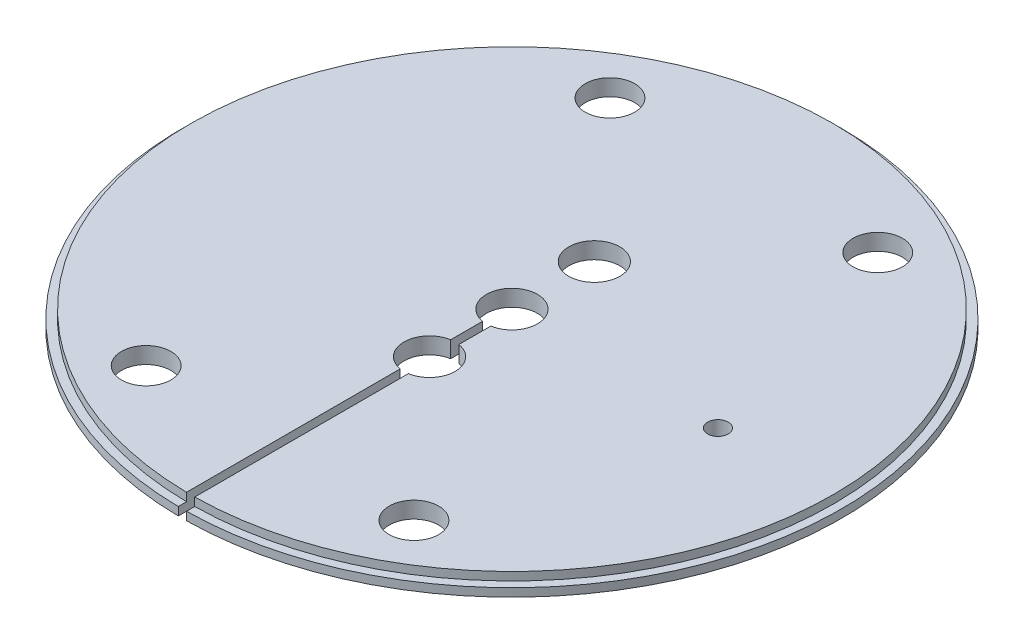
ISO-10303-21;
HEADER;
FILE_DESCRIPTION(('STEP AP214'),'2;1');
FILE_NAME('part.step','',(''),(''),'','','');
FILE_SCHEMA(('AUTOMOTIVE_DESIGN { 1 0 10303 214 1 1 1 1 }'));
ENDSEC;
DATA;
#1=APPLICATION_CONTEXT('core data for automotive mechanical design processes');
#2=APPLICATION_PROTOCOL_DEFINITION('international standard','automotive_design',2000,#1);
#3=PRODUCT_CONTEXT('',#1,'mechanical');
#4=PRODUCT('Part','Part','',(#3));
#5=PRODUCT_RELATED_PRODUCT_CATEGORY('part','',(#4));
#6=PRODUCT_DEFINITION_FORMATION('','',#4);
#7=PRODUCT_DEFINITION_CONTEXT('part definition',#1,'design');
#8=PRODUCT_DEFINITION('design','',#6,#7);
#9=PRODUCT_DEFINITION_SHAPE('','',#8);
#10=(LENGTH_UNIT() NAMED_UNIT(*) SI_UNIT(.MILLI.,.METRE.));
#11=(NAMED_UNIT(*) PLANE_ANGLE_UNIT() SI_UNIT($,.RADIAN.));
#12=(NAMED_UNIT(*) SI_UNIT($,.STERADIAN.) SOLID_ANGLE_UNIT());
#13=UNCERTAINTY_MEASURE_WITH_UNIT(LENGTH_MEASURE(1.E-05),#10,'distance_accuracy_value','');
#14=(GEOMETRIC_REPRESENTATION_CONTEXT(3) GLOBAL_UNCERTAINTY_ASSIGNED_CONTEXT((#13)) GLOBAL_UNIT_ASSIGNED_CONTEXT((#10,
#11,#12)) REPRESENTATION_CONTEXT('',''));
#15=CARTESIAN_POINT('',(0.,0.,0.));
#16=DIRECTION('',(0.,0.,1.));
#17=DIRECTION('',(1.,0.,0.));
#18=AXIS2_PLACEMENT_3D('',#15,#16,#17);
#19=CARTESIAN_POINT('',(25.,2.1,0.));
#20=DIRECTION('',(0.,-1.,0.));
#21=DIRECTION('',(0.,0.,-1.));
#22=AXIS2_PLACEMENT_3D('',#19,#20,#21);
#23=CYLINDRICAL_SURFACE('',#22,1.5);
#24=CARTESIAN_POINT('',(25.,2.,0.));
#25=DIRECTION('',(0.,-1.,0.));
#26=DIRECTION('',(0.,0.,1.));
#27=AXIS2_PLACEMENT_3D('',#24,#25,#26);
#28=CIRCLE('',#27,1.5);
#29=CARTESIAN_POINT('',(25.,2.,1.5));
#30=VERTEX_POINT('',#29);
#31=EDGE_CURVE('P0_E11',#30,#30,#28,.T.);
#32=ORIENTED_EDGE('',*,*,#31,.T.);
#33=CARTESIAN_POINT('',(25.,0.,1.5));
#34=DIRECTION('',(0.,1.,0.));
#35=VECTOR('',#34,1.);
#36=LINE('',#33,#35);
#37=CARTESIAN_POINT('',(25.,0.,1.5));
#38=VERTEX_POINT('',#37);
#39=EDGE_CURVE('P0_E24',#38,#30,#36,.T.);
#40=ORIENTED_EDGE('',*,*,#39,.F.);
#41=CARTESIAN_POINT('',(25.,0.,0.));
#42=DIRECTION('',(0.,1.,0.));
#43=DIRECTION('',(0.,0.,1.));
#44=AXIS2_PLACEMENT_3D('',#41,#42,#43);
#45=CIRCLE('',#44,1.5);
#46=EDGE_CURVE('P0_E33',#38,#38,#45,.T.);
#47=ORIENTED_EDGE('',*,*,#46,.T.);
#48=ORIENTED_EDGE('',*,*,#39,.T.);
#49=EDGE_LOOP('',(#32,#40,#47,#48));
#50=FACE_BOUND('',#49,.T.);
#51=ADVANCED_FACE('P0_F16',(#50),#23,.T.);
#52=OPEN_SHELL('',(#51));
#53=SHELL_BASED_SURFACE_MODEL('P0_B1',(#52));
#54=CARTESIAN_POINT('',(0.,1.,0.));
#55=DIRECTION('',(0.,1.,0.));
#56=DIRECTION('',(0.,0.,-1.));
#57=AXIS2_PLACEMENT_3D('',#54,#55,#56);
#58=CYLINDRICAL_SURFACE('',#57,39.);
#59=DIRECTION('',(0.,1.,0.));
#60=VECTOR('',#59,1.);
#61=CARTESIAN_POINT('',(-0.50000000000001,1.,38.9967947400809));
#62=LINE('',#61,#60);
#63=CARTESIAN_POINT('',(-0.5,1.,38.9967947400809));
#64=VERTEX_POINT('',#63);
#65=CARTESIAN_POINT('',(-0.5,2.,38.9967947400809));
#66=VERTEX_POINT('',#65);
#67=EDGE_CURVE('P1_E212',#64,#66,#62,.T.);
#68=ORIENTED_EDGE('',*,*,#67,.T.);
#69=CARTESIAN_POINT('',(0.,2.,0.));
#70=DIRECTION('',(0.,1.,0.));
#71=DIRECTION('',(0.,0.,1.));
#72=AXIS2_PLACEMENT_3D('',#69,#70,#71);
#73=CIRCLE('',#72,39.);
#74=CARTESIAN_POINT('',(0.500000000000006,2.,38.9967947400809));
#75=VERTEX_POINT('',#74);
#76=EDGE_CURVE('P1_E28',#75,#66,#73,.T.);
#77=ORIENTED_EDGE('',*,*,#76,.F.);
#78=DIRECTION('',(0.,-1.,0.));
#79=VECTOR('',#78,1.);
#80=CARTESIAN_POINT('',(0.500000000000011,1.,38.9967947400809));
#81=LINE('',#80,#79);
#82=CARTESIAN_POINT('',(0.500000000000006,1.,38.9967947400809));
#83=VERTEX_POINT('',#82);
#84=EDGE_CURVE('P1_E228',#75,#83,#81,.T.);
#85=ORIENTED_EDGE('',*,*,#84,.T.);
#86=CARTESIAN_POINT('',(0.,1.,0.));
#87=DIRECTION('',(0.,-1.,0.));
#88=DIRECTION('',(0.,0.,1.));
#89=AXIS2_PLACEMENT_3D('',#86,#87,#88);
#90=CIRCLE('',#89,39.);
#91=EDGE_CURVE('P1_E11',#64,#83,#90,.T.);
#92=ORIENTED_EDGE('',*,*,#91,.F.);
#93=EDGE_LOOP('',(#68,#77,#85,#92));
#94=FACE_BOUND('',#93,.T.);
#95=ADVANCED_FACE('P1_F17',(#94),#58,.T.);
#96=CARTESIAN_POINT('',(0.,1.,0.));
#97=DIRECTION('',(0.,1.,0.));
#98=DIRECTION('',(1.,0.,0.));
#99=AXIS2_PLACEMENT_3D('',#96,#97,#98);
#100=PLANE('',#99);
#101=ORIENTED_EDGE('',*,*,#91,.T.);
#102=DIRECTION('',(0.,0.,1.));
#103=VECTOR('',#102,1.);
#104=CARTESIAN_POINT('',(0.5,1.,41.));
#105=LINE('',#104,#103);
#106=CARTESIAN_POINT('',(0.5,1.,39.9968748779201));
#107=VERTEX_POINT('',#106);
#108=EDGE_CURVE('P1_E225',#83,#107,#105,.T.);
#109=ORIENTED_EDGE('',*,*,#108,.T.);
#110=CARTESIAN_POINT('',(0.,1.,0.));
#111=DIRECTION('',(0.,-1.,0.));
#112=DIRECTION('',(0.,0.,1.));
#113=AXIS2_PLACEMENT_3D('',#110,#111,#112);
#114=CIRCLE('',#113,40.);
#115=CARTESIAN_POINT('',(-0.5,1.,39.9968748779201));
#116=VERTEX_POINT('',#115);
#117=EDGE_CURVE('P1_E232',#116,#107,#114,.T.);
#118=ORIENTED_EDGE('',*,*,#117,.F.);
#119=DIRECTION('',(0.,0.,-1.));
#120=VECTOR('',#119,1.);
#121=CARTESIAN_POINT('',(-0.5,1.,0.));
#122=LINE('',#121,#120);
#123=EDGE_CURVE('P1_E215',#116,#64,#122,.T.);
#124=ORIENTED_EDGE('',*,*,#123,.T.);
#125=EDGE_LOOP('',(#101,#109,#118,#124));
#126=FACE_BOUND('',#125,.T.);
#127=ADVANCED_FACE('P1_F352',(#126),#100,.T.);
#128=CARTESIAN_POINT('',(0.,2.,0.));
#129=DIRECTION('',(0.,1.,0.));
#130=DIRECTION('',(1.,0.,0.));
#131=AXIS2_PLACEMENT_3D('',#128,#129,#130);
#132=PLANE('',#131);
#133=CARTESIAN_POINT('',(0.,2.,-10.));
#134=DIRECTION('',(0.,-1.,0.));
#135=DIRECTION('',(0.,0.,-1.));
#136=AXIS2_PLACEMENT_3D('',#133,#134,#135);
#137=CIRCLE('',#136,3.1);
#138=CARTESIAN_POINT('',(0.,2.,-6.9));
#139=VERTEX_POINT('',#138);
#140=EDGE_CURVE('P1_E260',#139,#139,#137,.T.);
#141=ORIENTED_EDGE('',*,*,#140,.T.);
#142=EDGE_LOOP('',(#141));
#143=FACE_BOUND('',#142,.T.);
#144=CARTESIAN_POINT('',(16.25,2.,28.14582562299));
#145=DIRECTION('',(0.,-1.,0.));
#146=DIRECTION('',(0.,0.,1.));
#147=AXIS2_PLACEMENT_3D('',#144,#145,#146);
#148=CIRCLE('',#147,3.);
#149=CARTESIAN_POINT('',(16.25,2.,25.14582562299));
#150=VERTEX_POINT('',#149);
#151=EDGE_CURVE('P1_E121',#150,#150,#148,.T.);
#152=ORIENTED_EDGE('',*,*,#151,.T.);
#153=EDGE_LOOP('',(#152));
#154=FACE_BOUND('',#153,.T.);
#155=CARTESIAN_POINT('',(-16.25,2.,28.14582562299));
#156=DIRECTION('',(0.,-1.,0.));
#157=DIRECTION('',(0.,0.,1.));
#158=AXIS2_PLACEMENT_3D('',#155,#156,#157);
#159=CIRCLE('',#158,3.);
#160=CARTESIAN_POINT('',(-16.25,2.,25.14582562299));
#161=VERTEX_POINT('',#160);
#162=EDGE_CURVE('P1_E21',#161,#161,#159,.T.);
#163=ORIENTED_EDGE('',*,*,#162,.T.);
#164=EDGE_LOOP('',(#163));
#165=FACE_BOUND('',#164,.T.);
#166=CARTESIAN_POINT('',(-16.25,2.,-28.14582562299));
#167=DIRECTION('',(0.,-1.,0.));
#168=DIRECTION('',(0.,0.,1.));
#169=AXIS2_PLACEMENT_3D('',#166,#167,#168);
#170=CIRCLE('',#169,3.);
#171=CARTESIAN_POINT('',(-16.25,2.,-31.14582562299));
#172=VERTEX_POINT('',#171);
#173=EDGE_CURVE('P1_E171',#172,#172,#170,.T.);
#174=ORIENTED_EDGE('',*,*,#173,.T.);
#175=EDGE_LOOP('',(#174));
#176=FACE_BOUND('',#175,.T.);
#177=CARTESIAN_POINT('',(16.25,2.,-28.14582562299));
#178=DIRECTION('',(0.,-1.,0.));
#179=DIRECTION('',(0.,0.,1.));
#180=AXIS2_PLACEMENT_3D('',#177,#178,#179);
#181=CIRCLE('',#180,3.);
#182=CARTESIAN_POINT('',(16.25,2.,-31.14582562299));
#183=VERTEX_POINT('',#182);
#184=EDGE_CURVE('P1_E233',#183,#183,#181,.T.);
#185=ORIENTED_EDGE('',*,*,#184,.T.);
#186=EDGE_LOOP('',(#185));
#187=FACE_BOUND('',#186,.T.);
#188=CARTESIAN_POINT('',(25.,2.,0.));
#189=DIRECTION('',(0.,-1.,0.));
#190=DIRECTION('',(0.,0.,-1.));
#191=AXIS2_PLACEMENT_3D('',#188,#189,#190);
#192=CIRCLE('',#191,1.25);
#193=CARTESIAN_POINT('',(25.,2.,1.25));
#194=VERTEX_POINT('',#193);
#195=EDGE_CURVE('P1_E286',#194,#194,#192,.T.);
#196=ORIENTED_EDGE('',*,*,#195,.T.);
#197=EDGE_LOOP('',(#196));
#198=FACE_BOUND('',#197,.T.);
#199=DIRECTION('',(0.,0.,-1.));
#200=VECTOR('',#199,1.);
#201=CARTESIAN_POINT('',(-0.5,2.,0.));
#202=LINE('',#201,#200);
#203=CARTESIAN_POINT('',(-0.5,2.,13.0594117081578));
#204=VERTEX_POINT('',#203);
#205=EDGE_CURVE('P1_E224',#66,#204,#202,.T.);
#206=ORIENTED_EDGE('',*,*,#205,.T.);
#207=CARTESIAN_POINT('',(0.,2.,10.));
#208=DIRECTION('',(0.,-1.,0.));
#209=DIRECTION('',(0.,0.,1.));
#210=AXIS2_PLACEMENT_3D('',#207,#208,#209);
#211=CIRCLE('',#210,3.1);
#212=CARTESIAN_POINT('',(-0.5,2.,6.94058829184416));
#213=VERTEX_POINT('',#212);
#214=EDGE_CURVE('P1_E42',#204,#213,#211,.T.);
#215=ORIENTED_EDGE('',*,*,#214,.T.);
#216=DIRECTION('',(0.,0.,-1.));
#217=VECTOR('',#216,1.);
#218=CARTESIAN_POINT('',(-0.5,2.,0.));
#219=LINE('',#218,#217);
#220=CARTESIAN_POINT('',(-0.499999999999975,2.,3.05941170815568));
#221=VERTEX_POINT('',#220);
#222=EDGE_CURVE('P1_E282',#213,#221,#219,.T.);
#223=ORIENTED_EDGE('',*,*,#222,.T.);
#224=CARTESIAN_POINT('',(0.,2.,0.));
#225=DIRECTION('',(0.,-1.,0.));
#226=DIRECTION('',(0.,0.,1.));
#227=AXIS2_PLACEMENT_3D('',#224,#225,#226);
#228=CIRCLE('',#227,3.1);
#229=CARTESIAN_POINT('',(0.5,2.,3.05941170815583));
#230=VERTEX_POINT('',#229);
#231=EDGE_CURVE('P1_E278',#221,#230,#228,.T.);
#232=ORIENTED_EDGE('',*,*,#231,.T.);
#233=DIRECTION('',(0.,0.,1.));
#234=VECTOR('',#233,1.);
#235=CARTESIAN_POINT('',(0.5,2.,41.));
#236=LINE('',#235,#234);
#237=CARTESIAN_POINT('',(0.499999999999974,2.,6.94058829184432));
#238=VERTEX_POINT('',#237);
#239=EDGE_CURVE('P1_E274',#230,#238,#236,.T.);
#240=ORIENTED_EDGE('',*,*,#239,.T.);
#241=CARTESIAN_POINT('',(0.,2.,10.));
#242=DIRECTION('',(0.,-1.,0.));
#243=DIRECTION('',(0.,0.,1.));
#244=AXIS2_PLACEMENT_3D('',#241,#242,#243);
#245=CIRCLE('',#244,3.1);
#246=CARTESIAN_POINT('',(0.5,2.,13.0594117081578));
#247=VERTEX_POINT('',#246);
#248=EDGE_CURVE('P1_E204',#238,#247,#245,.T.);
#249=ORIENTED_EDGE('',*,*,#248,.T.);
#250=DIRECTION('',(0.,0.,1.));
#251=VECTOR('',#250,1.);
#252=CARTESIAN_POINT('',(0.5,2.,41.));
#253=LINE('',#252,#251);
#254=EDGE_CURVE('P1_E256',#247,#75,#253,.T.);
#255=ORIENTED_EDGE('',*,*,#254,.T.);
#256=ORIENTED_EDGE('',*,*,#76,.T.);
#257=EDGE_LOOP('',(#206,#215,#223,#232,#240,#249,#255,#256));
#258=FACE_BOUND('',#257,.T.);
#259=ADVANCED_FACE('P1_F172',(#143,#154,#165,#176,#187,#198,#258),#132,.T.);
#260=CARTESIAN_POINT('',(0.,0.,10.));
#261=DIRECTION('',(0.,1.,0.));
#262=DIRECTION('',(0.,0.,1.));
#263=AXIS2_PLACEMENT_3D('',#260,#261,#262);
#264=CYLINDRICAL_SURFACE('',#263,3.1);
#265=CARTESIAN_POINT('',(0.,0.,10.));
#266=DIRECTION('',(0.,-1.,0.));
#267=DIRECTION('',(0.,0.,1.));
#268=AXIS2_PLACEMENT_3D('',#265,#266,#267);
#269=CIRCLE('',#268,3.1);
#270=CARTESIAN_POINT('',(-0.5,0.,13.0594117081578));
#271=VERTEX_POINT('',#270);
#272=CARTESIAN_POINT('',(-0.5,0.,6.94058829184416));
#273=VERTEX_POINT('',#272);
#274=EDGE_CURVE('P1_E193',#271,#273,#269,.T.);
#275=ORIENTED_EDGE('',*,*,#274,.T.);
#276=DIRECTION('',(0.,1.,0.));
#277=VECTOR('',#276,1.);
#278=CARTESIAN_POINT('',(-0.5,0.,6.940588291844));
#279=LINE('',#278,#277);
#280=EDGE_CURVE('P1_E281',#273,#213,#279,.T.);
#281=ORIENTED_EDGE('',*,*,#280,.T.);
#282=ORIENTED_EDGE('',*,*,#214,.F.);
#283=DIRECTION('',(0.,-1.,0.));
#284=VECTOR('',#283,1.);
#285=CARTESIAN_POINT('',(-0.5,0.,13.05941170816));
#286=LINE('',#285,#284);
#287=EDGE_CURVE('P1_E221',#204,#271,#286,.T.);
#288=ORIENTED_EDGE('',*,*,#287,.T.);
#289=EDGE_LOOP('',(#275,#281,#282,#288));
#290=FACE_BOUND('',#289,.T.);
#291=ADVANCED_FACE('P1_F346',(#290),#264,.F.);
#292=CARTESIAN_POINT('',(-0.5,0.,0.));
#293=DIRECTION('',(-1.,0.,0.));
#294=DIRECTION('',(0.,0.,1.));
#295=AXIS2_PLACEMENT_3D('',#292,#293,#294);
#296=PLANE('',#295);
#297=DIRECTION('',(0.,1.,0.));
#298=VECTOR('',#297,1.);
#299=CARTESIAN_POINT('',(-0.49999999999995,0.,3.05941170815568));
#300=LINE('',#299,#298);
#301=CARTESIAN_POINT('',(-0.499999999999975,0.,3.05941170815568));
#302=VERTEX_POINT('',#301);
#303=EDGE_CURVE('P1_E285',#302,#221,#300,.T.);
#304=ORIENTED_EDGE('',*,*,#303,.T.);
#305=ORIENTED_EDGE('',*,*,#222,.F.);
#306=ORIENTED_EDGE('',*,*,#280,.F.);
#307=DIRECTION('',(0.,0.,-1.));
#308=VECTOR('',#307,1.);
#309=CARTESIAN_POINT('',(-0.5,0.,0.));
#310=LINE('',#309,#308);
#311=EDGE_CURVE('P1_E198',#273,#302,#310,.T.);
#312=ORIENTED_EDGE('',*,*,#311,.T.);
#313=EDGE_LOOP('',(#304,#305,#306,#312));
#314=FACE_BOUND('',#313,.T.);
#315=ADVANCED_FACE('P1_F385',(#314),#296,.F.);
#316=CARTESIAN_POINT('',(0.,0.,0.));
#317=DIRECTION('',(0.,1.,0.));
#318=DIRECTION('',(0.,0.,-1.));
#319=AXIS2_PLACEMENT_3D('',#316,#317,#318);
#320=CYLINDRICAL_SURFACE('',#319,3.1);
#321=ORIENTED_EDGE('',*,*,#231,.F.);
#322=ORIENTED_EDGE('',*,*,#303,.F.);
#323=CARTESIAN_POINT('',(0.,0.,0.));
#324=DIRECTION('',(0.,-1.,0.));
#325=DIRECTION('',(0.,0.,1.));
#326=AXIS2_PLACEMENT_3D('',#323,#324,#325);
#327=CIRCLE('',#326,3.1);
#328=CARTESIAN_POINT('',(0.5,0.,3.05941170815583));
#329=VERTEX_POINT('',#328);
#330=EDGE_CURVE('P1_E250',#302,#329,#327,.T.);
#331=ORIENTED_EDGE('',*,*,#330,.T.);
#332=DIRECTION('',(0.,1.,0.));
#333=VECTOR('',#332,1.);
#334=CARTESIAN_POINT('',(0.5,0.,3.059411708156));
#335=LINE('',#334,#333);
#336=EDGE_CURVE('P1_E203',#329,#230,#335,.T.);
#337=ORIENTED_EDGE('',*,*,#336,.T.);
#338=EDGE_LOOP('',(#321,#322,#331,#337));
#339=FACE_BOUND('',#338,.T.);
#340=ADVANCED_FACE('P1_F376',(#339),#320,.F.);
#341=CARTESIAN_POINT('',(0.5,0.,41.));
#342=DIRECTION('',(1.,0.,0.));
#343=DIRECTION('',(0.,1.,0.));
#344=AXIS2_PLACEMENT_3D('',#341,#342,#343);
#345=PLANE('',#344);
#346=ORIENTED_EDGE('',*,*,#336,.F.);
#347=DIRECTION('',(0.,0.,1.));
#348=VECTOR('',#347,1.);
#349=CARTESIAN_POINT('',(0.5,0.,0.));
#350=LINE('',#349,#348);
#351=CARTESIAN_POINT('',(0.499999999999974,0.,6.94058829184432));
#352=VERTEX_POINT('',#351);
#353=EDGE_CURVE('P1_E270',#329,#352,#350,.T.);
#354=ORIENTED_EDGE('',*,*,#353,.T.);
#355=DIRECTION('',(0.,1.,0.));
#356=VECTOR('',#355,1.);
#357=CARTESIAN_POINT('',(0.499999999999948,0.,6.94058829184432));
#358=LINE('',#357,#356);
#359=EDGE_CURVE('P1_E199',#352,#238,#358,.T.);
#360=ORIENTED_EDGE('',*,*,#359,.T.);
#361=ORIENTED_EDGE('',*,*,#239,.F.);
#362=EDGE_LOOP('',(#346,#354,#360,#361));
#363=FACE_BOUND('',#362,.T.);
#364=ADVANCED_FACE('P1_F382',(#363),#345,.F.);
#365=CARTESIAN_POINT('',(0.,0.,10.));
#366=DIRECTION('',(0.,1.,0.));
#367=DIRECTION('',(0.,0.,1.));
#368=AXIS2_PLACEMENT_3D('',#365,#366,#367);
#369=CYLINDRICAL_SURFACE('',#368,3.1);
#370=ORIENTED_EDGE('',*,*,#248,.F.);
#371=ORIENTED_EDGE('',*,*,#359,.F.);
#372=CARTESIAN_POINT('',(0.,0.,10.));
#373=DIRECTION('',(0.,-1.,0.));
#374=DIRECTION('',(0.,0.,1.));
#375=AXIS2_PLACEMENT_3D('',#372,#373,#374);
#376=CIRCLE('',#375,3.1);
#377=CARTESIAN_POINT('',(0.5,0.,13.0594117081578));
#378=VERTEX_POINT('',#377);
#379=EDGE_CURVE('P1_E266',#352,#378,#376,.T.);
#380=ORIENTED_EDGE('',*,*,#379,.T.);
#381=DIRECTION('',(0.,1.,0.));
#382=VECTOR('',#381,1.);
#383=CARTESIAN_POINT('',(0.5,0.,13.05941170816));
#384=LINE('',#383,#382);
#385=EDGE_CURVE('P1_E252',#378,#247,#384,.T.);
#386=ORIENTED_EDGE('',*,*,#385,.T.);
#387=EDGE_LOOP('',(#370,#371,#380,#386));
#388=FACE_BOUND('',#387,.T.);
#389=ADVANCED_FACE('P1_F19',(#388),#369,.F.);
#390=CARTESIAN_POINT('',(0.5,0.,41.));
#391=DIRECTION('',(1.,0.,0.));
#392=DIRECTION('',(0.,1.,0.));
#393=AXIS2_PLACEMENT_3D('',#390,#391,#392);
#394=PLANE('',#393);
#395=DIRECTION('',(0.,-1.,0.));
#396=VECTOR('',#395,1.);
#397=CARTESIAN_POINT('',(0.5,0.,39.9968748779201));
#398=LINE('',#397,#396);
#399=CARTESIAN_POINT('',(0.5,0.,39.9968748779201));
#400=VERTEX_POINT('',#399);
#401=EDGE_CURVE('P1_E229',#107,#400,#398,.T.);
#402=ORIENTED_EDGE('',*,*,#401,.F.);
#403=ORIENTED_EDGE('',*,*,#108,.F.);
#404=ORIENTED_EDGE('',*,*,#84,.F.);
#405=ORIENTED_EDGE('',*,*,#254,.F.);
#406=ORIENTED_EDGE('',*,*,#385,.F.);
#407=DIRECTION('',(0.,0.,1.));
#408=VECTOR('',#407,1.);
#409=CARTESIAN_POINT('',(0.5,0.,0.));
#410=LINE('',#409,#408);
#411=EDGE_CURVE('P1_E271',#378,#400,#410,.T.);
#412=ORIENTED_EDGE('',*,*,#411,.T.);
#413=EDGE_LOOP('',(#402,#403,#404,#405,#406,#412));
#414=FACE_BOUND('',#413,.T.);
#415=ADVANCED_FACE('P1_F480',(#414),#394,.F.);
#416=CARTESIAN_POINT('',(0.,0.,0.));
#417=DIRECTION('',(0.,1.,0.));
#418=DIRECTION('',(0.,0.,-1.));
#419=AXIS2_PLACEMENT_3D('',#416,#417,#418);
#420=CYLINDRICAL_SURFACE('',#419,40.);
#421=DIRECTION('',(0.,1.,0.));
#422=VECTOR('',#421,1.);
#423=CARTESIAN_POINT('',(-0.5,0.,39.99687487792));
#424=LINE('',#423,#422);
#425=CARTESIAN_POINT('',(-0.5,0.,39.9968748779201));
#426=VERTEX_POINT('',#425);
#427=EDGE_CURVE('P1_E217',#426,#116,#424,.T.);
#428=ORIENTED_EDGE('',*,*,#427,.T.);
#429=ORIENTED_EDGE('',*,*,#117,.T.);
#430=ORIENTED_EDGE('',*,*,#401,.T.);
#431=CARTESIAN_POINT('',(0.,0.,0.));
#432=DIRECTION('',(0.,1.,0.));
#433=DIRECTION('',(0.,0.,1.));
#434=AXIS2_PLACEMENT_3D('',#431,#432,#433);
#435=CIRCLE('',#434,40.);
#436=EDGE_CURVE('P1_E305',#400,#426,#435,.T.);
#437=ORIENTED_EDGE('',*,*,#436,.T.);
#438=EDGE_LOOP('',(#428,#429,#430,#437));
#439=FACE_BOUND('',#438,.T.);
#440=ADVANCED_FACE('P1_F353',(#439),#420,.T.);
#441=CARTESIAN_POINT('',(-0.5,0.,0.));
#442=DIRECTION('',(-1.,0.,0.));
#443=DIRECTION('',(0.,0.,1.));
#444=AXIS2_PLACEMENT_3D('',#441,#442,#443);
#445=PLANE('',#444);
#446=ORIENTED_EDGE('',*,*,#67,.F.);
#447=ORIENTED_EDGE('',*,*,#123,.F.);
#448=ORIENTED_EDGE('',*,*,#427,.F.);
#449=DIRECTION('',(0.,0.,-1.));
#450=VECTOR('',#449,1.);
#451=CARTESIAN_POINT('',(-0.5,0.,0.));
#452=LINE('',#451,#450);
#453=EDGE_CURVE('P1_E197',#426,#271,#452,.T.);
#454=ORIENTED_EDGE('',*,*,#453,.T.);
#455=ORIENTED_EDGE('',*,*,#287,.F.);
#456=ORIENTED_EDGE('',*,*,#205,.F.);
#457=EDGE_LOOP('',(#446,#447,#448,#454,#455,#456));
#458=FACE_BOUND('',#457,.T.);
#459=ADVANCED_FACE('P1_F337',(#458),#445,.F.);
#460=CARTESIAN_POINT('',(0.,0.,0.));
#461=DIRECTION('',(0.,1.,0.));
#462=DIRECTION('',(1.,0.,0.));
#463=AXIS2_PLACEMENT_3D('',#460,#461,#462);
#464=PLANE('',#463);
#465=CARTESIAN_POINT('',(0.,0.,-10.));
#466=DIRECTION('',(0.,-1.,0.));
#467=DIRECTION('',(0.,0.,-1.));
#468=AXIS2_PLACEMENT_3D('',#465,#466,#467);
#469=CIRCLE('',#468,3.1);
#470=CARTESIAN_POINT('',(0.,0.,-6.9));
#471=VERTEX_POINT('',#470);
#472=EDGE_CURVE('P1_E259',#471,#471,#469,.T.);
#473=ORIENTED_EDGE('',*,*,#472,.F.);
#474=EDGE_LOOP('',(#473));
#475=FACE_BOUND('',#474,.T.);
#476=CARTESIAN_POINT('',(16.25,0.,28.14582562299));
#477=DIRECTION('',(0.,-1.,0.));
#478=DIRECTION('',(0.,0.,1.));
#479=AXIS2_PLACEMENT_3D('',#476,#477,#478);
#480=CIRCLE('',#479,3.);
#481=CARTESIAN_POINT('',(16.25,0.,25.14582562299));
#482=VERTEX_POINT('',#481);
#483=EDGE_CURVE('P1_E211',#482,#482,#480,.T.);
#484=ORIENTED_EDGE('',*,*,#483,.F.);
#485=EDGE_LOOP('',(#484));
#486=FACE_BOUND('',#485,.T.);
#487=CARTESIAN_POINT('',(-16.25,0.,28.14582562299));
#488=DIRECTION('',(0.,-1.,0.));
#489=DIRECTION('',(0.,0.,1.));
#490=AXIS2_PLACEMENT_3D('',#487,#488,#489);
#491=CIRCLE('',#490,3.);
#492=CARTESIAN_POINT('',(-16.25,0.,25.14582562299));
#493=VERTEX_POINT('',#492);
#494=EDGE_CURVE('P1_E177',#493,#493,#491,.T.);
#495=ORIENTED_EDGE('',*,*,#494,.F.);
#496=EDGE_LOOP('',(#495));
#497=FACE_BOUND('',#496,.T.);
#498=CARTESIAN_POINT('',(-16.25,0.,-28.14582562299));
#499=DIRECTION('',(0.,-1.,0.));
#500=DIRECTION('',(0.,0.,1.));
#501=AXIS2_PLACEMENT_3D('',#498,#499,#500);
#502=CIRCLE('',#501,3.);
#503=CARTESIAN_POINT('',(-16.25,0.,-31.14582562299));
#504=VERTEX_POINT('',#503);
#505=EDGE_CURVE('P1_E188',#504,#504,#502,.T.);
#506=ORIENTED_EDGE('',*,*,#505,.F.);
#507=EDGE_LOOP('',(#506));
#508=FACE_BOUND('',#507,.T.);
#509=CARTESIAN_POINT('',(16.25,0.,-28.14582562299));
#510=DIRECTION('',(0.,-1.,0.));
#511=DIRECTION('',(0.,0.,1.));
#512=AXIS2_PLACEMENT_3D('',#509,#510,#511);
#513=CIRCLE('',#512,3.);
#514=CARTESIAN_POINT('',(16.25,0.,-31.14582562299));
#515=VERTEX_POINT('',#514);
#516=EDGE_CURVE('P1_E261',#515,#515,#513,.T.);
#517=ORIENTED_EDGE('',*,*,#516,.F.);
#518=EDGE_LOOP('',(#517));
#519=FACE_BOUND('',#518,.T.);
#520=CARTESIAN_POINT('',(25.,0.,0.));
#521=DIRECTION('',(0.,-1.,0.));
#522=DIRECTION('',(0.,0.,-1.));
#523=AXIS2_PLACEMENT_3D('',#520,#521,#522);
#524=CIRCLE('',#523,1.25);
#525=CARTESIAN_POINT('',(25.,0.,1.25));
#526=VERTEX_POINT('',#525);
#527=EDGE_CURVE('P1_E265',#526,#526,#524,.T.);
#528=ORIENTED_EDGE('',*,*,#527,.F.);
#529=EDGE_LOOP('',(#528));
#530=FACE_BOUND('',#529,.T.);
#531=ORIENTED_EDGE('',*,*,#436,.F.);
#532=ORIENTED_EDGE('',*,*,#411,.F.);
#533=ORIENTED_EDGE('',*,*,#379,.F.);
#534=ORIENTED_EDGE('',*,*,#353,.F.);
#535=ORIENTED_EDGE('',*,*,#330,.F.);
#536=ORIENTED_EDGE('',*,*,#311,.F.);
#537=ORIENTED_EDGE('',*,*,#274,.F.);
#538=ORIENTED_EDGE('',*,*,#453,.F.);
#539=EDGE_LOOP('',(#531,#532,#533,#534,#535,#536,#537,#538));
#540=FACE_BOUND('',#539,.T.);
#541=ADVANCED_FACE('P1_F343',(#475,#486,#497,#508,#519,#530,#540),#464,.F.);
#542=CARTESIAN_POINT('',(0.,0.,-10.));
#543=DIRECTION('',(0.,-1.,0.));
#544=DIRECTION('',(0.,0.,-1.));
#545=AXIS2_PLACEMENT_3D('',#542,#543,#544);
#546=CYLINDRICAL_SURFACE('',#545,3.1);
#547=ORIENTED_EDGE('',*,*,#140,.F.);
#548=DIRECTION('',(0.,-1.,0.));
#549=VECTOR('',#548,1.);
#550=CARTESIAN_POINT('',(0.,0.,-6.9));
#551=LINE('',#550,#549);
#552=EDGE_CURVE('P1_E110',#139,#471,#551,.T.);
#553=ORIENTED_EDGE('',*,*,#552,.T.);
#554=ORIENTED_EDGE('',*,*,#472,.T.);
#555=ORIENTED_EDGE('',*,*,#552,.F.);
#556=EDGE_LOOP('',(#547,#553,#554,#555));
#557=FACE_BOUND('',#556,.T.);
#558=ADVANCED_FACE('P1_F488',(#557),#546,.F.);
#559=CARTESIAN_POINT('',(16.25,0.,28.14582562299));
#560=DIRECTION('',(0.,1.,0.));
#561=DIRECTION('',(0.,0.,1.));
#562=AXIS2_PLACEMENT_3D('',#559,#560,#561);
#563=CYLINDRICAL_SURFACE('',#562,3.);
#564=ORIENTED_EDGE('',*,*,#483,.T.);
#565=DIRECTION('',(0.,1.,0.));
#566=VECTOR('',#565,1.);
#567=CARTESIAN_POINT('',(16.25,0.,25.14582562299));
#568=LINE('',#567,#566);
#569=EDGE_CURVE('P1_E207',#482,#150,#568,.T.);
#570=ORIENTED_EDGE('',*,*,#569,.T.);
#571=ORIENTED_EDGE('',*,*,#151,.F.);
#572=ORIENTED_EDGE('',*,*,#569,.F.);
#573=EDGE_LOOP('',(#564,#570,#571,#572));
#574=FACE_BOUND('',#573,.T.);
#575=ADVANCED_FACE('P1_F467',(#574),#563,.F.);
#576=CARTESIAN_POINT('',(-16.25,0.,28.14582562299));
#577=DIRECTION('',(0.,1.,0.));
#578=DIRECTION('',(0.,0.,1.));
#579=AXIS2_PLACEMENT_3D('',#576,#577,#578);
#580=CYLINDRICAL_SURFACE('',#579,3.);
#581=ORIENTED_EDGE('',*,*,#494,.T.);
#582=DIRECTION('',(0.,1.,0.));
#583=VECTOR('',#582,1.);
#584=CARTESIAN_POINT('',(-16.25,0.,25.14582562299));
#585=LINE('',#584,#583);
#586=EDGE_CURVE('P1_E186',#493,#161,#585,.T.);
#587=ORIENTED_EDGE('',*,*,#586,.T.);
#588=ORIENTED_EDGE('',*,*,#162,.F.);
#589=ORIENTED_EDGE('',*,*,#586,.F.);
#590=EDGE_LOOP('',(#581,#587,#588,#589));
#591=FACE_BOUND('',#590,.T.);
#592=ADVANCED_FACE('P1_F461',(#591),#580,.F.);
#593=CARTESIAN_POINT('',(-16.25,0.,-28.14582562299));
#594=DIRECTION('',(0.,1.,0.));
#595=DIRECTION('',(0.,0.,1.));
#596=AXIS2_PLACEMENT_3D('',#593,#594,#595);
#597=CYLINDRICAL_SURFACE('',#596,3.);
#598=ORIENTED_EDGE('',*,*,#505,.T.);
#599=DIRECTION('',(0.,1.,0.));
#600=VECTOR('',#599,1.);
#601=CARTESIAN_POINT('',(-16.25,0.,-31.14582562299));
#602=LINE('',#601,#600);
#603=EDGE_CURVE('P1_E178',#504,#172,#602,.T.);
#604=ORIENTED_EDGE('',*,*,#603,.T.);
#605=ORIENTED_EDGE('',*,*,#173,.F.);
#606=ORIENTED_EDGE('',*,*,#603,.F.);
#607=EDGE_LOOP('',(#598,#604,#605,#606));
#608=FACE_BOUND('',#607,.T.);
#609=ADVANCED_FACE('P1_F466',(#608),#597,.F.);
#610=CARTESIAN_POINT('',(16.25,0.,-28.14582562299));
#611=DIRECTION('',(0.,1.,0.));
#612=DIRECTION('',(0.,0.,1.));
#613=AXIS2_PLACEMENT_3D('',#610,#611,#612);
#614=CYLINDRICAL_SURFACE('',#613,3.);
#615=ORIENTED_EDGE('',*,*,#516,.T.);
#616=DIRECTION('',(0.,1.,0.));
#617=VECTOR('',#616,1.);
#618=CARTESIAN_POINT('',(16.25,0.,-31.14582562299));
#619=LINE('',#618,#617);
#620=EDGE_CURVE('P1_E235',#515,#183,#619,.T.);
#621=ORIENTED_EDGE('',*,*,#620,.T.);
#622=ORIENTED_EDGE('',*,*,#184,.F.);
#623=ORIENTED_EDGE('',*,*,#620,.F.);
#624=EDGE_LOOP('',(#615,#621,#622,#623));
#625=FACE_BOUND('',#624,.T.);
#626=ADVANCED_FACE('P1_F508',(#625),#614,.F.);
#627=CARTESIAN_POINT('',(25.,2.1,0.));
#628=DIRECTION('',(0.,-1.,0.));
#629=DIRECTION('',(0.,0.,-1.));
#630=AXIS2_PLACEMENT_3D('',#627,#628,#629);
#631=CYLINDRICAL_SURFACE('',#630,1.25);
#632=ORIENTED_EDGE('',*,*,#195,.F.);
#633=DIRECTION('',(0.,-1.,0.));
#634=VECTOR('',#633,1.);
#635=CARTESIAN_POINT('',(25.,2.1,1.25));
#636=LINE('',#635,#634);
#637=EDGE_CURVE('P1_E290',#194,#526,#636,.T.);
#638=ORIENTED_EDGE('',*,*,#637,.T.);
#639=ORIENTED_EDGE('',*,*,#527,.T.);
#640=ORIENTED_EDGE('',*,*,#637,.F.);
#641=EDGE_LOOP('',(#632,#638,#639,#640));
#642=FACE_BOUND('',#641,.T.);
#643=ADVANCED_FACE('P1_F513',(#642),#631,.F.);
#644=CLOSED_SHELL('',(#95,#127,#259,#291,#315,#340,#364,#389,#415,#440,#459,#541,#558,#575,#592,
#609,#626,#643));
#645=MANIFOLD_SOLID_BREP('P1_B1',#644);
#646=ADVANCED_BREP_SHAPE_REPRESENTATION('',(#18,#645),#14);
#647=MANIFOLD_SURFACE_SHAPE_REPRESENTATION('',(#18,#53),#14);
#648=SHAPE_REPRESENTATION('',(#18),#14);
#649=SHAPE_DEFINITION_REPRESENTATION(#9,#648);
#650=SHAPE_REPRESENTATION_RELATIONSHIP('','',#648,#646);
#651=SHAPE_REPRESENTATION_RELATIONSHIP('','',#648,#647);
ENDSEC;
END-ISO-10303-21;
